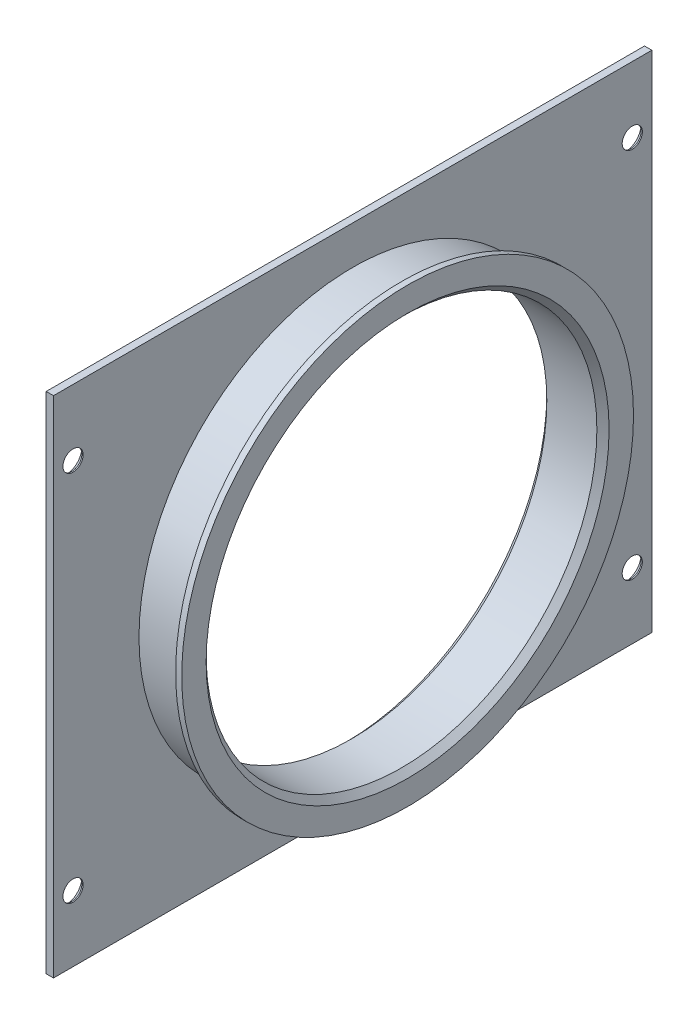
ISO-10303-21;
HEADER;
FILE_DESCRIPTION(('STEP AP214'),'2;1');
FILE_NAME('part.step','',(''),(''),'','','');
FILE_SCHEMA(('AUTOMOTIVE_DESIGN { 1 0 10303 214 1 1 1 1 }'));
ENDSEC;
DATA;
#1=APPLICATION_CONTEXT('core data for automotive mechanical design processes');
#2=APPLICATION_PROTOCOL_DEFINITION('international standard','automotive_design',2000,#1);
#3=PRODUCT_CONTEXT('',#1,'mechanical');
#4=PRODUCT('Part','Part','',(#3));
#5=PRODUCT_RELATED_PRODUCT_CATEGORY('part','',(#4));
#6=PRODUCT_DEFINITION_FORMATION('','',#4);
#7=PRODUCT_DEFINITION_CONTEXT('part definition',#1,'design');
#8=PRODUCT_DEFINITION('design','',#6,#7);
#9=PRODUCT_DEFINITION_SHAPE('','',#8);
#10=(LENGTH_UNIT() NAMED_UNIT(*) SI_UNIT(.MILLI.,.METRE.));
#11=(NAMED_UNIT(*) PLANE_ANGLE_UNIT() SI_UNIT($,.RADIAN.));
#12=(NAMED_UNIT(*) SI_UNIT($,.STERADIAN.) SOLID_ANGLE_UNIT());
#13=UNCERTAINTY_MEASURE_WITH_UNIT(LENGTH_MEASURE(1.E-05),#10,'distance_accuracy_value','');
#14=(GEOMETRIC_REPRESENTATION_CONTEXT(3) GLOBAL_UNCERTAINTY_ASSIGNED_CONTEXT((#13)) GLOBAL_UNIT_ASSIGNED_CONTEXT((#10,
#11,#12)) REPRESENTATION_CONTEXT('',''));
#15=CARTESIAN_POINT('',(0.,0.,0.));
#16=DIRECTION('',(0.,0.,1.));
#17=DIRECTION('',(1.,0.,0.));
#18=AXIS2_PLACEMENT_3D('',#15,#16,#17);
#19=CARTESIAN_POINT('',(1.2,0.,0.));
#20=DIRECTION('',(0.,1.,0.));
#21=DIRECTION('',(0.,0.,1.));
#22=AXIS2_PLACEMENT_3D('',#19,#20,#21);
#23=PLANE('',#22);
#24=DIRECTION('',(0.,0.,-1.));
#25=VECTOR('',#24,1.);
#26=CARTESIAN_POINT('',(0.,0.,0.));
#27=LINE('',#26,#25);
#28=CARTESIAN_POINT('',(0.,0.,98.));
#29=VERTEX_POINT('',#28);
#30=CARTESIAN_POINT('',(0.,0.,0.));
#31=VERTEX_POINT('',#30);
#32=EDGE_CURVE('E118',#29,#31,#27,.T.);
#33=ORIENTED_EDGE('',*,*,#32,.T.);
#34=DIRECTION('',(-1.,0.,0.));
#35=VECTOR('',#34,1.);
#36=CARTESIAN_POINT('',(1.2,0.,0.));
#37=LINE('',#36,#35);
#38=CARTESIAN_POINT('',(1.2,0.,0.));
#39=VERTEX_POINT('',#38);
#40=EDGE_CURVE('E110',#39,#31,#37,.T.);
#41=ORIENTED_EDGE('',*,*,#40,.F.);
#42=DIRECTION('',(0.,0.,-1.));
#43=VECTOR('',#42,1.);
#44=CARTESIAN_POINT('',(1.2,0.,0.));
#45=LINE('',#44,#43);
#46=CARTESIAN_POINT('',(1.2,0.,98.));
#47=VERTEX_POINT('',#46);
#48=EDGE_CURVE('E101',#47,#39,#45,.T.);
#49=ORIENTED_EDGE('',*,*,#48,.F.);
#50=DIRECTION('',(-1.,0.,0.));
#51=VECTOR('',#50,1.);
#52=CARTESIAN_POINT('',(1.2,0.,98.));
#53=LINE('',#52,#51);
#54=EDGE_CURVE('E115',#47,#29,#53,.T.);
#55=ORIENTED_EDGE('',*,*,#54,.T.);
#56=EDGE_LOOP('',(#33,#41,#49,#55));
#57=FACE_BOUND('',#56,.T.);
#58=ADVANCED_FACE('F50',(#57),#23,.F.);
#59=CARTESIAN_POINT('',(1.2,0.,0.));
#60=DIRECTION('',(0.,0.,1.));
#61=DIRECTION('',(1.,0.,0.));
#62=AXIS2_PLACEMENT_3D('',#59,#60,#61);
#63=PLANE('',#62);
#64=DIRECTION('',(0.,1.,0.));
#65=VECTOR('',#64,1.);
#66=CARTESIAN_POINT('',(0.,0.,0.));
#67=LINE('',#66,#65);
#68=CARTESIAN_POINT('',(0.,82.6,0.));
#69=VERTEX_POINT('',#68);
#70=EDGE_CURVE('E106',#31,#69,#67,.T.);
#71=ORIENTED_EDGE('',*,*,#70,.T.);
#72=DIRECTION('',(-1.,0.,0.));
#73=VECTOR('',#72,1.);
#74=CARTESIAN_POINT('',(1.2,82.6,0.));
#75=LINE('',#74,#73);
#76=CARTESIAN_POINT('',(1.2,82.6,0.));
#77=VERTEX_POINT('',#76);
#78=EDGE_CURVE('E102',#77,#69,#75,.T.);
#79=ORIENTED_EDGE('',*,*,#78,.F.);
#80=DIRECTION('',(0.,1.,0.));
#81=VECTOR('',#80,1.);
#82=CARTESIAN_POINT('',(1.2,0.,0.));
#83=LINE('',#82,#81);
#84=EDGE_CURVE('E96',#39,#77,#83,.T.);
#85=ORIENTED_EDGE('',*,*,#84,.F.);
#86=ORIENTED_EDGE('',*,*,#40,.T.);
#87=EDGE_LOOP('',(#71,#79,#85,#86));
#88=FACE_BOUND('',#87,.T.);
#89=ADVANCED_FACE('F104',(#88),#63,.F.);
#90=CARTESIAN_POINT('',(1.2,82.6,0.));
#91=DIRECTION('',(0.,-1.,0.));
#92=DIRECTION('',(0.,0.,-1.));
#93=AXIS2_PLACEMENT_3D('',#90,#91,#92);
#94=PLANE('',#93);
#95=DIRECTION('',(0.,0.,1.));
#96=VECTOR('',#95,1.);
#97=CARTESIAN_POINT('',(0.,82.6,0.));
#98=LINE('',#97,#96);
#99=CARTESIAN_POINT('',(0.,82.6,98.));
#100=VERTEX_POINT('',#99);
#101=EDGE_CURVE('E85',#69,#100,#98,.T.);
#102=ORIENTED_EDGE('',*,*,#101,.T.);
#103=DIRECTION('',(-1.,0.,0.));
#104=VECTOR('',#103,1.);
#105=CARTESIAN_POINT('',(1.2,82.6,98.));
#106=LINE('',#105,#104);
#107=CARTESIAN_POINT('',(1.2,82.6,98.));
#108=VERTEX_POINT('',#107);
#109=EDGE_CURVE('E107',#108,#100,#106,.T.);
#110=ORIENTED_EDGE('',*,*,#109,.F.);
#111=DIRECTION('',(0.,0.,1.));
#112=VECTOR('',#111,1.);
#113=CARTESIAN_POINT('',(1.2,82.6,0.));
#114=LINE('',#113,#112);
#115=EDGE_CURVE('E97',#77,#108,#114,.T.);
#116=ORIENTED_EDGE('',*,*,#115,.F.);
#117=ORIENTED_EDGE('',*,*,#78,.T.);
#118=EDGE_LOOP('',(#102,#110,#116,#117));
#119=FACE_BOUND('',#118,.T.);
#120=ADVANCED_FACE('F109',(#119),#94,.F.);
#121=CARTESIAN_POINT('',(1.2,0.,98.));
#122=DIRECTION('',(0.,0.,-1.));
#123=DIRECTION('',(-1.,0.,0.));
#124=AXIS2_PLACEMENT_3D('',#121,#122,#123);
#125=PLANE('',#124);
#126=DIRECTION('',(0.,-1.,0.));
#127=VECTOR('',#126,1.);
#128=CARTESIAN_POINT('',(0.,0.,98.));
#129=LINE('',#128,#127);
#130=EDGE_CURVE('E86',#100,#29,#129,.T.);
#131=ORIENTED_EDGE('',*,*,#130,.T.);
#132=ORIENTED_EDGE('',*,*,#54,.F.);
#133=DIRECTION('',(0.,-1.,0.));
#134=VECTOR('',#133,1.);
#135=CARTESIAN_POINT('',(1.2,0.,98.));
#136=LINE('',#135,#134);
#137=EDGE_CURVE('E64',#108,#47,#136,.T.);
#138=ORIENTED_EDGE('',*,*,#137,.F.);
#139=ORIENTED_EDGE('',*,*,#109,.T.);
#140=EDGE_LOOP('',(#131,#132,#138,#139));
#141=FACE_BOUND('',#140,.T.);
#142=ADVANCED_FACE('F181',(#141),#125,.F.);
#143=CARTESIAN_POINT('',(1.2,0.,0.));
#144=DIRECTION('',(-1.,0.,0.));
#145=DIRECTION('',(0.,0.,1.));
#146=AXIS2_PLACEMENT_3D('',#143,#144,#145);
#147=PLANE('',#146);
#148=CARTESIAN_POINT('',(1.2,41.3,49.));
#149=DIRECTION('',(1.,0.,0.));
#150=DIRECTION('',(0.,0.,-1.));
#151=AXIS2_PLACEMENT_3D('',#148,#149,#150);
#152=CIRCLE('',#151,35.);
#153=CARTESIAN_POINT('',(1.2,41.3,14.));
#154=VERTEX_POINT('',#153);
#155=EDGE_CURVE('E127',#154,#154,#152,.T.);
#156=ORIENTED_EDGE('',*,*,#155,.F.);
#157=EDGE_LOOP('',(#156));
#158=FACE_BOUND('',#157,.T.);
#159=CARTESIAN_POINT('',(1.2,71.8,94.8));
#160=DIRECTION('',(1.,0.,0.));
#161=DIRECTION('',(0.,0.,-1.));
#162=AXIS2_PLACEMENT_3D('',#159,#160,#161);
#163=CIRCLE('',#162,1.65);
#164=CARTESIAN_POINT('',(1.2,71.8,93.15));
#165=VERTEX_POINT('',#164);
#166=EDGE_CURVE('E242',#165,#165,#163,.T.);
#167=ORIENTED_EDGE('',*,*,#166,.F.);
#168=EDGE_LOOP('',(#167));
#169=FACE_BOUND('',#168,.T.);
#170=CARTESIAN_POINT('',(1.2,10.8,3.2));
#171=DIRECTION('',(1.,0.,0.));
#172=DIRECTION('',(0.,0.,-1.));
#173=AXIS2_PLACEMENT_3D('',#170,#171,#172);
#174=CIRCLE('',#173,1.65);
#175=CARTESIAN_POINT('',(1.2,10.8,1.55));
#176=VERTEX_POINT('',#175);
#177=EDGE_CURVE('E246',#176,#176,#174,.T.);
#178=ORIENTED_EDGE('',*,*,#177,.F.);
#179=EDGE_LOOP('',(#178));
#180=FACE_BOUND('',#179,.T.);
#181=CARTESIAN_POINT('',(1.2,71.8,3.19999999999999));
#182=DIRECTION('',(1.,0.,0.));
#183=DIRECTION('',(0.,0.,-1.));
#184=AXIS2_PLACEMENT_3D('',#181,#182,#183);
#185=CIRCLE('',#184,1.65);
#186=CARTESIAN_POINT('',(1.2,71.8,1.54999999999999));
#187=VERTEX_POINT('',#186);
#188=EDGE_CURVE('E253',#187,#187,#185,.T.);
#189=ORIENTED_EDGE('',*,*,#188,.F.);
#190=EDGE_LOOP('',(#189));
#191=FACE_BOUND('',#190,.T.);
#192=CARTESIAN_POINT('',(1.2,10.8,94.8));
#193=DIRECTION('',(1.,0.,0.));
#194=DIRECTION('',(0.,0.,-1.));
#195=AXIS2_PLACEMENT_3D('',#192,#193,#194);
#196=CIRCLE('',#195,1.65);
#197=CARTESIAN_POINT('',(1.2,10.8,93.15));
#198=VERTEX_POINT('',#197);
#199=EDGE_CURVE('E117',#198,#198,#196,.T.);
#200=ORIENTED_EDGE('',*,*,#199,.F.);
#201=EDGE_LOOP('',(#200));
#202=FACE_BOUND('',#201,.T.);
#203=ORIENTED_EDGE('',*,*,#48,.T.);
#204=ORIENTED_EDGE('',*,*,#84,.T.);
#205=ORIENTED_EDGE('',*,*,#115,.T.);
#206=ORIENTED_EDGE('',*,*,#137,.T.);
#207=EDGE_LOOP('',(#203,#204,#205,#206));
#208=FACE_BOUND('',#207,.T.);
#209=ADVANCED_FACE('F100',(#158,#169,#180,#191,#202,#208),#147,.F.);
#210=CARTESIAN_POINT('',(0.,0.,0.));
#211=DIRECTION('',(-1.,0.,0.));
#212=DIRECTION('',(0.,0.,1.));
#213=AXIS2_PLACEMENT_3D('',#210,#211,#212);
#214=PLANE('',#213);
#215=CARTESIAN_POINT('',(0.,41.3,49.));
#216=DIRECTION('',(-1.,0.,0.));
#217=DIRECTION('',(0.,0.,1.));
#218=AXIS2_PLACEMENT_3D('',#215,#216,#217);
#219=CIRCLE('',#218,33.);
#220=CARTESIAN_POINT('',(0.,41.3,82.));
#221=VERTEX_POINT('',#220);
#222=EDGE_CURVE('E151',#221,#221,#219,.F.);
#223=ORIENTED_EDGE('',*,*,#222,.T.);
#224=EDGE_LOOP('',(#223));
#225=FACE_BOUND('',#224,.T.);
#226=CARTESIAN_POINT('',(0.,10.8,3.2));
#227=DIRECTION('',(-1.,0.,0.));
#228=DIRECTION('',(0.,0.,1.));
#229=AXIS2_PLACEMENT_3D('',#226,#227,#228);
#230=CIRCLE('',#229,2.64999999999999);
#231=CARTESIAN_POINT('',(0.,10.8,5.84999999999999));
#232=VERTEX_POINT('',#231);
#233=EDGE_CURVE('E136',#232,#232,#230,.F.);
#234=ORIENTED_EDGE('',*,*,#233,.T.);
#235=EDGE_LOOP('',(#234));
#236=FACE_BOUND('',#235,.T.);
#237=CARTESIAN_POINT('',(0.,71.8,3.19999999999999));
#238=DIRECTION('',(-1.,0.,0.));
#239=DIRECTION('',(0.,0.,1.));
#240=AXIS2_PLACEMENT_3D('',#237,#238,#239);
#241=CIRCLE('',#240,2.65000000000003);
#242=CARTESIAN_POINT('',(0.,71.8,5.85000000000002));
#243=VERTEX_POINT('',#242);
#244=EDGE_CURVE('E131',#243,#243,#241,.F.);
#245=ORIENTED_EDGE('',*,*,#244,.T.);
#246=EDGE_LOOP('',(#245));
#247=FACE_BOUND('',#246,.T.);
#248=CARTESIAN_POINT('',(0.,10.8,94.8));
#249=DIRECTION('',(-1.,0.,0.));
#250=DIRECTION('',(0.,0.,1.));
#251=AXIS2_PLACEMENT_3D('',#248,#249,#250);
#252=CIRCLE('',#251,2.65000000000001);
#253=CARTESIAN_POINT('',(0.,10.8,97.45));
#254=VERTEX_POINT('',#253);
#255=EDGE_CURVE('E128',#254,#254,#252,.F.);
#256=ORIENTED_EDGE('',*,*,#255,.T.);
#257=EDGE_LOOP('',(#256));
#258=FACE_BOUND('',#257,.T.);
#259=CARTESIAN_POINT('',(0.,71.8,94.8));
#260=DIRECTION('',(-1.,0.,0.));
#261=DIRECTION('',(0.,0.,1.));
#262=AXIS2_PLACEMENT_3D('',#259,#260,#261);
#263=CIRCLE('',#262,2.65000000000001);
#264=CARTESIAN_POINT('',(0.,71.8,97.45));
#265=VERTEX_POINT('',#264);
#266=EDGE_CURVE('E130',#265,#265,#263,.F.);
#267=ORIENTED_EDGE('',*,*,#266,.T.);
#268=EDGE_LOOP('',(#267));
#269=FACE_BOUND('',#268,.T.);
#270=ORIENTED_EDGE('',*,*,#32,.F.);
#271=ORIENTED_EDGE('',*,*,#130,.F.);
#272=ORIENTED_EDGE('',*,*,#101,.F.);
#273=ORIENTED_EDGE('',*,*,#70,.F.);
#274=EDGE_LOOP('',(#270,#271,#272,#273));
#275=FACE_BOUND('',#274,.T.);
#276=ADVANCED_FACE('F169',(#225,#236,#247,#258,#269,#275),#214,.T.);
#277=CARTESIAN_POINT('',(0.,10.8,94.8));
#278=DIRECTION('',(1.,0.,0.));
#279=DIRECTION('',(0.,0.,-1.));
#280=AXIS2_PLACEMENT_3D('',#277,#278,#279);
#281=CYLINDRICAL_SURFACE('',#280,1.65);
#282=CARTESIAN_POINT('',(1.00000000000001,10.8,94.8));
#283=DIRECTION('',(-1.,0.,0.));
#284=DIRECTION('',(0.,0.,1.));
#285=AXIS2_PLACEMENT_3D('',#282,#283,#284);
#286=CIRCLE('',#285,1.65);
#287=CARTESIAN_POINT('',(1.00000000000001,10.8,96.45));
#288=VERTEX_POINT('',#287);
#289=EDGE_CURVE('E144',#288,#288,#286,.T.);
#290=ORIENTED_EDGE('',*,*,#289,.T.);
#291=EDGE_LOOP('',(#290));
#292=FACE_BOUND('',#291,.T.);
#293=ORIENTED_EDGE('',*,*,#199,.T.);
#294=EDGE_LOOP('',(#293));
#295=FACE_BOUND('',#294,.T.);
#296=ADVANCED_FACE('F173',(#292,#295),#281,.F.);
#297=CARTESIAN_POINT('',(0.,71.8,3.19999999999999));
#298=DIRECTION('',(1.,0.,0.));
#299=DIRECTION('',(0.,0.,-1.));
#300=AXIS2_PLACEMENT_3D('',#297,#298,#299);
#301=CYLINDRICAL_SURFACE('',#300,1.65);
#302=CARTESIAN_POINT('',(1.00000000000002,71.8,3.19999999999999));
#303=DIRECTION('',(-1.,0.,0.));
#304=DIRECTION('',(0.,0.,1.));
#305=AXIS2_PLACEMENT_3D('',#302,#303,#304);
#306=CIRCLE('',#305,1.65);
#307=CARTESIAN_POINT('',(1.00000000000002,71.8,4.85));
#308=VERTEX_POINT('',#307);
#309=EDGE_CURVE('E142',#308,#308,#306,.T.);
#310=ORIENTED_EDGE('',*,*,#309,.T.);
#311=EDGE_LOOP('',(#310));
#312=FACE_BOUND('',#311,.T.);
#313=ORIENTED_EDGE('',*,*,#188,.T.);
#314=EDGE_LOOP('',(#313));
#315=FACE_BOUND('',#314,.T.);
#316=ADVANCED_FACE('F295',(#312,#315),#301,.F.);
#317=CARTESIAN_POINT('',(0.,10.8,3.2));
#318=DIRECTION('',(1.,0.,0.));
#319=DIRECTION('',(0.,0.,-1.));
#320=AXIS2_PLACEMENT_3D('',#317,#318,#319);
#321=CYLINDRICAL_SURFACE('',#320,1.65);
#322=CARTESIAN_POINT('',(0.999999999999993,10.8,3.2));
#323=DIRECTION('',(-1.,0.,0.));
#324=DIRECTION('',(0.,0.,1.));
#325=AXIS2_PLACEMENT_3D('',#322,#323,#324);
#326=CIRCLE('',#325,1.65);
#327=CARTESIAN_POINT('',(0.999999999999993,10.8,4.85));
#328=VERTEX_POINT('',#327);
#329=EDGE_CURVE('E137',#328,#328,#326,.T.);
#330=ORIENTED_EDGE('',*,*,#329,.T.);
#331=EDGE_LOOP('',(#330));
#332=FACE_BOUND('',#331,.T.);
#333=ORIENTED_EDGE('',*,*,#177,.T.);
#334=EDGE_LOOP('',(#333));
#335=FACE_BOUND('',#334,.T.);
#336=ADVANCED_FACE('F238',(#332,#335),#321,.F.);
#337=CARTESIAN_POINT('',(0.,71.8,94.8));
#338=DIRECTION('',(1.,0.,0.));
#339=DIRECTION('',(0.,0.,-1.));
#340=AXIS2_PLACEMENT_3D('',#337,#338,#339);
#341=CYLINDRICAL_SURFACE('',#340,1.65);
#342=CARTESIAN_POINT('',(1.,71.8,94.8));
#343=DIRECTION('',(-1.,0.,0.));
#344=DIRECTION('',(0.,0.,1.));
#345=AXIS2_PLACEMENT_3D('',#342,#343,#344);
#346=CIRCLE('',#345,1.65);
#347=CARTESIAN_POINT('',(1.,71.8,96.45));
#348=VERTEX_POINT('',#347);
#349=EDGE_CURVE('E146',#348,#348,#346,.T.);
#350=ORIENTED_EDGE('',*,*,#349,.T.);
#351=EDGE_LOOP('',(#350));
#352=FACE_BOUND('',#351,.T.);
#353=ORIENTED_EDGE('',*,*,#166,.T.);
#354=EDGE_LOOP('',(#353));
#355=FACE_BOUND('',#354,.T.);
#356=ADVANCED_FACE('F237',(#352,#355),#341,.F.);
#357=CARTESIAN_POINT('',(9.2,41.3,49.));
#358=DIRECTION('',(-1.,0.,0.));
#359=DIRECTION('',(0.,0.,1.));
#360=AXIS2_PLACEMENT_3D('',#357,#358,#359);
#361=CYLINDRICAL_SURFACE('',#360,35.);
#362=CARTESIAN_POINT('',(9.2,41.3,49.));
#363=DIRECTION('',(1.,0.,0.));
#364=DIRECTION('',(0.,0.,-1.));
#365=AXIS2_PLACEMENT_3D('',#362,#363,#364);
#366=CIRCLE('',#365,35.);
#367=CARTESIAN_POINT('',(9.2,41.3,14.));
#368=VERTEX_POINT('',#367);
#369=EDGE_CURVE('E258',#368,#368,#366,.T.);
#370=ORIENTED_EDGE('',*,*,#369,.F.);
#371=EDGE_LOOP('',(#370));
#372=FACE_BOUND('',#371,.T.);
#373=ORIENTED_EDGE('',*,*,#155,.T.);
#374=EDGE_LOOP('',(#373));
#375=FACE_BOUND('',#374,.T.);
#376=ADVANCED_FACE('F239',(#372,#375),#361,.T.);
#377=CARTESIAN_POINT('',(10.2,41.3,49.));
#378=DIRECTION('',(-1.,0.,0.));
#379=DIRECTION('',(0.,0.,1.));
#380=AXIS2_PLACEMENT_3D('',#377,#378,#379);
#381=CYLINDRICAL_SURFACE('',#380,37.);
#382=CARTESIAN_POINT('',(10.2,41.3,49.));
#383=DIRECTION('',(1.,0.,0.));
#384=DIRECTION('',(0.,0.,-1.));
#385=AXIS2_PLACEMENT_3D('',#382,#383,#384);
#386=CIRCLE('',#385,37.);
#387=CARTESIAN_POINT('',(10.2,41.3,12.));
#388=VERTEX_POINT('',#387);
#389=EDGE_CURVE('E261',#388,#388,#386,.T.);
#390=ORIENTED_EDGE('',*,*,#389,.F.);
#391=EDGE_LOOP('',(#390));
#392=FACE_BOUND('',#391,.T.);
#393=CARTESIAN_POINT('',(9.2,41.3,49.));
#394=DIRECTION('',(1.,0.,0.));
#395=DIRECTION('',(0.,0.,-1.));
#396=AXIS2_PLACEMENT_3D('',#393,#394,#395);
#397=CIRCLE('',#396,37.);
#398=CARTESIAN_POINT('',(9.2,41.3,12.));
#399=VERTEX_POINT('',#398);
#400=EDGE_CURVE('E265',#399,#399,#397,.T.);
#401=ORIENTED_EDGE('',*,*,#400,.T.);
#402=EDGE_LOOP('',(#401));
#403=FACE_BOUND('',#402,.T.);
#404=ADVANCED_FACE('F269',(#392,#403),#381,.T.);
#405=CARTESIAN_POINT('',(10.2,41.3,49.));
#406=DIRECTION('',(1.,0.,0.));
#407=DIRECTION('',(0.,0.,-1.));
#408=AXIS2_PLACEMENT_3D('',#405,#406,#407);
#409=PLANE('',#408);
#410=CARTESIAN_POINT('',(10.2,41.3,49.));
#411=DIRECTION('',(1.,0.,0.));
#412=DIRECTION('',(0.,0.,-1.));
#413=AXIS2_PLACEMENT_3D('',#410,#411,#412);
#414=CIRCLE('',#413,33.);
#415=CARTESIAN_POINT('',(10.2,41.3,16.));
#416=VERTEX_POINT('',#415);
#417=EDGE_CURVE('E11',#416,#416,#414,.F.);
#418=ORIENTED_EDGE('',*,*,#417,.T.);
#419=EDGE_LOOP('',(#418));
#420=FACE_BOUND('',#419,.T.);
#421=ORIENTED_EDGE('',*,*,#389,.T.);
#422=EDGE_LOOP('',(#421));
#423=FACE_BOUND('',#422,.T.);
#424=ADVANCED_FACE('F268',(#420,#423),#409,.T.);
#425=CARTESIAN_POINT('',(9.2,41.3,49.));
#426=DIRECTION('',(1.,0.,0.));
#427=DIRECTION('',(0.,0.,-1.));
#428=AXIS2_PLACEMENT_3D('',#425,#426,#427);
#429=PLANE('',#428);
#430=ORIENTED_EDGE('',*,*,#369,.T.);
#431=EDGE_LOOP('',(#430));
#432=FACE_BOUND('',#431,.T.);
#433=ORIENTED_EDGE('',*,*,#400,.F.);
#434=EDGE_LOOP('',(#433));
#435=FACE_BOUND('',#434,.T.);
#436=ADVANCED_FACE('F277',(#432,#435),#429,.F.);
#437=CARTESIAN_POINT('',(0.,41.3,49.));
#438=DIRECTION('',(1.,0.,0.));
#439=DIRECTION('',(0.,0.,-1.));
#440=AXIS2_PLACEMENT_3D('',#437,#438,#439);
#441=CYLINDRICAL_SURFACE('',#440,32.);
#442=CARTESIAN_POINT('',(0.999999999999994,41.3,49.));
#443=DIRECTION('',(-1.,0.,0.));
#444=DIRECTION('',(0.,0.,1.));
#445=AXIS2_PLACEMENT_3D('',#442,#443,#444);
#446=CIRCLE('',#445,32.);
#447=CARTESIAN_POINT('',(0.999999999999994,41.3,81.));
#448=VERTEX_POINT('',#447);
#449=EDGE_CURVE('E60',#448,#448,#446,.T.);
#450=ORIENTED_EDGE('',*,*,#449,.T.);
#451=EDGE_LOOP('',(#450));
#452=FACE_BOUND('',#451,.T.);
#453=CARTESIAN_POINT('',(9.20000000000001,41.3,49.));
#454=DIRECTION('',(1.,0.,0.));
#455=DIRECTION('',(0.,0.,-1.));
#456=AXIS2_PLACEMENT_3D('',#453,#454,#455);
#457=CIRCLE('',#456,32.);
#458=CARTESIAN_POINT('',(9.20000000000001,41.3,17.));
#459=VERTEX_POINT('',#458);
#460=EDGE_CURVE('E152',#459,#459,#457,.T.);
#461=ORIENTED_EDGE('',*,*,#460,.T.);
#462=EDGE_LOOP('',(#461));
#463=FACE_BOUND('',#462,.T.);
#464=ADVANCED_FACE('F157',(#452,#463),#441,.F.);
#465=CARTESIAN_POINT('',(0.,10.8,3.2));
#466=DIRECTION('',(-1.,0.,0.));
#467=DIRECTION('',(0.,0.,1.));
#468=AXIS2_PLACEMENT_3D('',#465,#466,#467);
#469=CONICAL_SURFACE('',#468,2.64999999999999,0.785398163397444);
#470=ORIENTED_EDGE('',*,*,#329,.F.);
#471=EDGE_LOOP('',(#470));
#472=FACE_BOUND('',#471,.T.);
#473=ORIENTED_EDGE('',*,*,#233,.F.);
#474=EDGE_LOOP('',(#473));
#475=FACE_BOUND('',#474,.T.);
#476=ADVANCED_FACE('F203',(#472,#475),#469,.F.);
#477=CARTESIAN_POINT('',(0.,71.8,3.19999999999999));
#478=DIRECTION('',(-1.,0.,0.));
#479=DIRECTION('',(0.,0.,1.));
#480=AXIS2_PLACEMENT_3D('',#477,#478,#479);
#481=CONICAL_SURFACE('',#480,2.65000000000003,0.785398163397451);
#482=ORIENTED_EDGE('',*,*,#309,.F.);
#483=EDGE_LOOP('',(#482));
#484=FACE_BOUND('',#483,.T.);
#485=ORIENTED_EDGE('',*,*,#244,.F.);
#486=EDGE_LOOP('',(#485));
#487=FACE_BOUND('',#486,.T.);
#488=ADVANCED_FACE('F210',(#484,#487),#481,.F.);
#489=CARTESIAN_POINT('',(0.,10.8,94.8));
#490=DIRECTION('',(-1.,0.,0.));
#491=DIRECTION('',(0.,0.,1.));
#492=AXIS2_PLACEMENT_3D('',#489,#490,#491);
#493=CONICAL_SURFACE('',#492,2.65000000000001,0.785398163397452);
#494=ORIENTED_EDGE('',*,*,#289,.F.);
#495=EDGE_LOOP('',(#494));
#496=FACE_BOUND('',#495,.T.);
#497=ORIENTED_EDGE('',*,*,#255,.F.);
#498=EDGE_LOOP('',(#497));
#499=FACE_BOUND('',#498,.T.);
#500=ADVANCED_FACE('F212',(#496,#499),#493,.F.);
#501=CARTESIAN_POINT('',(0.,71.8,94.8));
#502=DIRECTION('',(-1.,0.,0.));
#503=DIRECTION('',(0.,0.,1.));
#504=AXIS2_PLACEMENT_3D('',#501,#502,#503);
#505=CONICAL_SURFACE('',#504,2.65000000000001,0.785398163397452);
#506=ORIENTED_EDGE('',*,*,#349,.F.);
#507=EDGE_LOOP('',(#506));
#508=FACE_BOUND('',#507,.T.);
#509=ORIENTED_EDGE('',*,*,#266,.F.);
#510=EDGE_LOOP('',(#509));
#511=FACE_BOUND('',#510,.T.);
#512=ADVANCED_FACE('F164',(#508,#511),#505,.F.);
#513=CARTESIAN_POINT('',(0.,41.3,49.));
#514=DIRECTION('',(-1.,0.,0.));
#515=DIRECTION('',(0.,0.,1.));
#516=AXIS2_PLACEMENT_3D('',#513,#514,#515);
#517=CONICAL_SURFACE('',#516,33.,0.785398163397448);
#518=ORIENTED_EDGE('',*,*,#449,.F.);
#519=EDGE_LOOP('',(#518));
#520=FACE_BOUND('',#519,.T.);
#521=ORIENTED_EDGE('',*,*,#222,.F.);
#522=EDGE_LOOP('',(#521));
#523=FACE_BOUND('',#522,.T.);
#524=ADVANCED_FACE('F165',(#520,#523),#517,.F.);
#525=CARTESIAN_POINT('',(9.20000000000001,41.3,49.));
#526=DIRECTION('',(1.,0.,0.));
#527=DIRECTION('',(0.,0.,-1.));
#528=AXIS2_PLACEMENT_3D('',#525,#526,#527);
#529=CONICAL_SURFACE('',#528,32.,0.785398163397448);
#530=ORIENTED_EDGE('',*,*,#417,.F.);
#531=EDGE_LOOP('',(#530));
#532=FACE_BOUND('',#531,.T.);
#533=ORIENTED_EDGE('',*,*,#460,.F.);
#534=EDGE_LOOP('',(#533));
#535=FACE_BOUND('',#534,.T.);
#536=ADVANCED_FACE('F49',(#532,#535),#529,.F.);
#537=CLOSED_SHELL('',(#58,#89,#120,#142,#209,#276,#296,#316,#336,#356,#376,#404,#424,#436,#464,
#476,#488,#500,#512,#524,#536));
#538=MANIFOLD_SOLID_BREP('B2',#537);
#539=ADVANCED_BREP_SHAPE_REPRESENTATION('',(#18,#538),#14);
#540=SHAPE_DEFINITION_REPRESENTATION(#9,#539);
ENDSEC;
END-ISO-10303-21;
